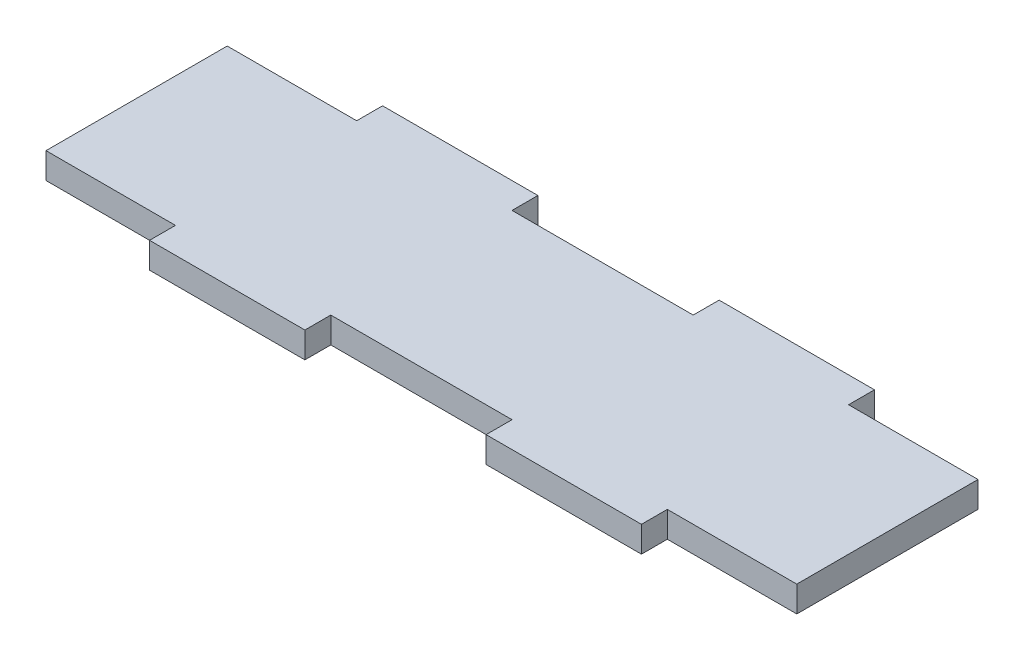
ISO-10303-21;
HEADER;
FILE_DESCRIPTION(('STEP AP214'),'2;1');
FILE_NAME('part.step','',(''),(''),'','','');
FILE_SCHEMA(('AUTOMOTIVE_DESIGN { 1 0 10303 214 1 1 1 1 }'));
ENDSEC;
DATA;
#1=APPLICATION_CONTEXT('core data for automotive mechanical design processes');
#2=APPLICATION_PROTOCOL_DEFINITION('international standard','automotive_design',2000,#1);
#3=PRODUCT_CONTEXT('',#1,'mechanical');
#4=PRODUCT('Part','Part','',(#3));
#5=PRODUCT_RELATED_PRODUCT_CATEGORY('part','',(#4));
#6=PRODUCT_DEFINITION_FORMATION('','',#4);
#7=PRODUCT_DEFINITION_CONTEXT('part definition',#1,'design');
#8=PRODUCT_DEFINITION('design','',#6,#7);
#9=PRODUCT_DEFINITION_SHAPE('','',#8);
#10=(LENGTH_UNIT() NAMED_UNIT(*) SI_UNIT(.MILLI.,.METRE.));
#11=(NAMED_UNIT(*) PLANE_ANGLE_UNIT() SI_UNIT($,.RADIAN.));
#12=(NAMED_UNIT(*) SI_UNIT($,.STERADIAN.) SOLID_ANGLE_UNIT());
#13=UNCERTAINTY_MEASURE_WITH_UNIT(LENGTH_MEASURE(1.E-05),#10,'distance_accuracy_value','');
#14=(GEOMETRIC_REPRESENTATION_CONTEXT(3) GLOBAL_UNCERTAINTY_ASSIGNED_CONTEXT((#13)) GLOBAL_UNIT_ASSIGNED_CONTEXT((#10,
#11,#12)) REPRESENTATION_CONTEXT('',''));
#15=CARTESIAN_POINT('',(0.,0.,0.));
#16=DIRECTION('',(0.,0.,1.));
#17=DIRECTION('',(1.,0.,0.));
#18=AXIS2_PLACEMENT_3D('',#15,#16,#17);
#19=CARTESIAN_POINT('',(290.,10.,-80.));
#20=DIRECTION('',(-1.,0.,0.));
#21=DIRECTION('',(0.,0.,1.));
#22=AXIS2_PLACEMENT_3D('',#19,#20,#21);
#23=PLANE('',#22);
#24=DIRECTION('',(0.,0.,-1.));
#25=VECTOR('',#24,1.);
#26=CARTESIAN_POINT('',(290.,0.,-80.));
#27=LINE('',#26,#25);
#28=CARTESIAN_POINT('',(290.,0.,-10.));
#29=VERTEX_POINT('',#28);
#30=CARTESIAN_POINT('',(290.,0.,-80.));
#31=VERTEX_POINT('',#30);
#32=EDGE_CURVE('E200',#29,#31,#27,.T.);
#33=ORIENTED_EDGE('',*,*,#32,.T.);
#34=DIRECTION('',(0.,-1.,0.));
#35=VECTOR('',#34,1.);
#36=CARTESIAN_POINT('',(290.,10.,-80.));
#37=LINE('',#36,#35);
#38=CARTESIAN_POINT('',(290.,10.,-80.));
#39=VERTEX_POINT('',#38);
#40=EDGE_CURVE('E11',#39,#31,#37,.T.);
#41=ORIENTED_EDGE('',*,*,#40,.F.);
#42=DIRECTION('',(0.,0.,-1.));
#43=VECTOR('',#42,1.);
#44=CARTESIAN_POINT('',(290.,10.,-80.));
#45=LINE('',#44,#43);
#46=CARTESIAN_POINT('',(290.,10.,-10.));
#47=VERTEX_POINT('',#46);
#48=EDGE_CURVE('E238',#47,#39,#45,.T.);
#49=ORIENTED_EDGE('',*,*,#48,.F.);
#50=DIRECTION('',(0.,-1.,0.));
#51=VECTOR('',#50,1.);
#52=CARTESIAN_POINT('',(290.,10.,-10.));
#53=LINE('',#52,#51);
#54=EDGE_CURVE('E196',#47,#29,#53,.T.);
#55=ORIENTED_EDGE('',*,*,#54,.T.);
#56=EDGE_LOOP('',(#33,#41,#49,#55));
#57=FACE_BOUND('',#56,.T.);
#58=ADVANCED_FACE('F32',(#57),#23,.F.);
#59=CARTESIAN_POINT('',(240.,10.,-80.));
#60=DIRECTION('',(0.,0.,1.));
#61=DIRECTION('',(1.,0.,0.));
#62=AXIS2_PLACEMENT_3D('',#59,#60,#61);
#63=PLANE('',#62);
#64=DIRECTION('',(-1.,0.,0.));
#65=VECTOR('',#64,1.);
#66=CARTESIAN_POINT('',(240.,0.,-80.));
#67=LINE('',#66,#65);
#68=CARTESIAN_POINT('',(240.,0.,-80.));
#69=VERTEX_POINT('',#68);
#70=EDGE_CURVE('E203',#31,#69,#67,.T.);
#71=ORIENTED_EDGE('',*,*,#70,.T.);
#72=DIRECTION('',(0.,-1.,0.));
#73=VECTOR('',#72,1.);
#74=CARTESIAN_POINT('',(240.,10.,-80.));
#75=LINE('',#74,#73);
#76=CARTESIAN_POINT('',(240.,10.,-80.));
#77=VERTEX_POINT('',#76);
#78=EDGE_CURVE('E40',#77,#69,#75,.T.);
#79=ORIENTED_EDGE('',*,*,#78,.F.);
#80=DIRECTION('',(-1.,0.,0.));
#81=VECTOR('',#80,1.);
#82=CARTESIAN_POINT('',(240.,10.,-80.));
#83=LINE('',#82,#81);
#84=EDGE_CURVE('E127',#39,#77,#83,.T.);
#85=ORIENTED_EDGE('',*,*,#84,.F.);
#86=ORIENTED_EDGE('',*,*,#40,.T.);
#87=EDGE_LOOP('',(#71,#79,#85,#86));
#88=FACE_BOUND('',#87,.T.);
#89=ADVANCED_FACE('F356',(#88),#63,.F.);
#90=CARTESIAN_POINT('',(240.,10.,-90.));
#91=DIRECTION('',(-1.,0.,0.));
#92=DIRECTION('',(0.,0.,1.));
#93=AXIS2_PLACEMENT_3D('',#90,#91,#92);
#94=PLANE('',#93);
#95=DIRECTION('',(0.,0.,-1.));
#96=VECTOR('',#95,1.);
#97=CARTESIAN_POINT('',(240.,0.,-90.));
#98=LINE('',#97,#96);
#99=CARTESIAN_POINT('',(240.,0.,-90.));
#100=VERTEX_POINT('',#99);
#101=EDGE_CURVE('E205',#69,#100,#98,.T.);
#102=ORIENTED_EDGE('',*,*,#101,.T.);
#103=DIRECTION('',(0.,-1.,0.));
#104=VECTOR('',#103,1.);
#105=CARTESIAN_POINT('',(240.,10.,-90.));
#106=LINE('',#105,#104);
#107=CARTESIAN_POINT('',(240.,10.,-90.));
#108=VERTEX_POINT('',#107);
#109=EDGE_CURVE('E281',#108,#100,#106,.T.);
#110=ORIENTED_EDGE('',*,*,#109,.F.);
#111=DIRECTION('',(0.,0.,-1.));
#112=VECTOR('',#111,1.);
#113=CARTESIAN_POINT('',(240.,10.,-90.));
#114=LINE('',#113,#112);
#115=EDGE_CURVE('E289',#77,#108,#114,.T.);
#116=ORIENTED_EDGE('',*,*,#115,.F.);
#117=ORIENTED_EDGE('',*,*,#78,.T.);
#118=EDGE_LOOP('',(#102,#110,#116,#117));
#119=FACE_BOUND('',#118,.T.);
#120=ADVANCED_FACE('F287',(#119),#94,.F.);
#121=CARTESIAN_POINT('',(180.,10.,-90.));
#122=DIRECTION('',(0.,0.,1.));
#123=DIRECTION('',(1.,0.,0.));
#124=AXIS2_PLACEMENT_3D('',#121,#122,#123);
#125=PLANE('',#124);
#126=DIRECTION('',(-1.,0.,0.));
#127=VECTOR('',#126,1.);
#128=CARTESIAN_POINT('',(180.,0.,-90.));
#129=LINE('',#128,#127);
#130=CARTESIAN_POINT('',(180.,0.,-90.));
#131=VERTEX_POINT('',#130);
#132=EDGE_CURVE('E207',#100,#131,#129,.T.);
#133=ORIENTED_EDGE('',*,*,#132,.T.);
#134=DIRECTION('',(0.,-1.,0.));
#135=VECTOR('',#134,1.);
#136=CARTESIAN_POINT('',(180.,10.,-90.));
#137=LINE('',#136,#135);
#138=CARTESIAN_POINT('',(180.,10.,-90.));
#139=VERTEX_POINT('',#138);
#140=EDGE_CURVE('E278',#139,#131,#137,.T.);
#141=ORIENTED_EDGE('',*,*,#140,.F.);
#142=DIRECTION('',(-1.,0.,0.));
#143=VECTOR('',#142,1.);
#144=CARTESIAN_POINT('',(180.,10.,-90.));
#145=LINE('',#144,#143);
#146=EDGE_CURVE('E307',#108,#139,#145,.T.);
#147=ORIENTED_EDGE('',*,*,#146,.F.);
#148=ORIENTED_EDGE('',*,*,#109,.T.);
#149=EDGE_LOOP('',(#133,#141,#147,#148));
#150=FACE_BOUND('',#149,.T.);
#151=ADVANCED_FACE('F298',(#150),#125,.F.);
#152=CARTESIAN_POINT('',(180.,10.,-80.));
#153=DIRECTION('',(1.,0.,0.));
#154=DIRECTION('',(0.,0.,-1.));
#155=AXIS2_PLACEMENT_3D('',#152,#153,#154);
#156=PLANE('',#155);
#157=DIRECTION('',(0.,0.,1.));
#158=VECTOR('',#157,1.);
#159=CARTESIAN_POINT('',(180.,0.,-80.));
#160=LINE('',#159,#158);
#161=CARTESIAN_POINT('',(180.,0.,-80.));
#162=VERTEX_POINT('',#161);
#163=EDGE_CURVE('E209',#131,#162,#160,.T.);
#164=ORIENTED_EDGE('',*,*,#163,.T.);
#165=DIRECTION('',(0.,-1.,0.));
#166=VECTOR('',#165,1.);
#167=CARTESIAN_POINT('',(180.,10.,-80.));
#168=LINE('',#167,#166);
#169=CARTESIAN_POINT('',(180.,10.,-80.));
#170=VERTEX_POINT('',#169);
#171=EDGE_CURVE('E275',#170,#162,#168,.T.);
#172=ORIENTED_EDGE('',*,*,#171,.F.);
#173=DIRECTION('',(0.,0.,1.));
#174=VECTOR('',#173,1.);
#175=CARTESIAN_POINT('',(180.,10.,-80.));
#176=LINE('',#175,#174);
#177=EDGE_CURVE('E304',#139,#170,#176,.T.);
#178=ORIENTED_EDGE('',*,*,#177,.F.);
#179=ORIENTED_EDGE('',*,*,#140,.T.);
#180=EDGE_LOOP('',(#164,#172,#178,#179));
#181=FACE_BOUND('',#180,.T.);
#182=ADVANCED_FACE('F302',(#181),#156,.F.);
#183=CARTESIAN_POINT('',(110.,10.,-80.));
#184=DIRECTION('',(0.,0.,1.));
#185=DIRECTION('',(1.,0.,0.));
#186=AXIS2_PLACEMENT_3D('',#183,#184,#185);
#187=PLANE('',#186);
#188=DIRECTION('',(-1.,0.,0.));
#189=VECTOR('',#188,1.);
#190=CARTESIAN_POINT('',(110.,0.,-80.));
#191=LINE('',#190,#189);
#192=CARTESIAN_POINT('',(110.,0.,-80.));
#193=VERTEX_POINT('',#192);
#194=EDGE_CURVE('E211',#162,#193,#191,.T.);
#195=ORIENTED_EDGE('',*,*,#194,.T.);
#196=DIRECTION('',(0.,-1.,0.));
#197=VECTOR('',#196,1.);
#198=CARTESIAN_POINT('',(110.,10.,-80.));
#199=LINE('',#198,#197);
#200=CARTESIAN_POINT('',(110.,10.,-80.));
#201=VERTEX_POINT('',#200);
#202=EDGE_CURVE('E272',#201,#193,#199,.T.);
#203=ORIENTED_EDGE('',*,*,#202,.F.);
#204=DIRECTION('',(-1.,0.,0.));
#205=VECTOR('',#204,1.);
#206=CARTESIAN_POINT('',(110.,10.,-80.));
#207=LINE('',#206,#205);
#208=EDGE_CURVE('E306',#170,#201,#207,.T.);
#209=ORIENTED_EDGE('',*,*,#208,.F.);
#210=ORIENTED_EDGE('',*,*,#171,.T.);
#211=EDGE_LOOP('',(#195,#203,#209,#210));
#212=FACE_BOUND('',#211,.T.);
#213=ADVANCED_FACE('F369',(#212),#187,.F.);
#214=CARTESIAN_POINT('',(110.,10.,-90.));
#215=DIRECTION('',(-1.,0.,0.));
#216=DIRECTION('',(0.,0.,1.));
#217=AXIS2_PLACEMENT_3D('',#214,#215,#216);
#218=PLANE('',#217);
#219=DIRECTION('',(0.,0.,-1.));
#220=VECTOR('',#219,1.);
#221=CARTESIAN_POINT('',(110.,0.,-90.));
#222=LINE('',#221,#220);
#223=CARTESIAN_POINT('',(110.,0.,-90.));
#224=VERTEX_POINT('',#223);
#225=EDGE_CURVE('E213',#193,#224,#222,.T.);
#226=ORIENTED_EDGE('',*,*,#225,.T.);
#227=DIRECTION('',(0.,-1.,0.));
#228=VECTOR('',#227,1.);
#229=CARTESIAN_POINT('',(110.,10.,-90.));
#230=LINE('',#229,#228);
#231=CARTESIAN_POINT('',(110.,10.,-90.));
#232=VERTEX_POINT('',#231);
#233=EDGE_CURVE('E269',#232,#224,#230,.T.);
#234=ORIENTED_EDGE('',*,*,#233,.F.);
#235=DIRECTION('',(0.,0.,-1.));
#236=VECTOR('',#235,1.);
#237=CARTESIAN_POINT('',(110.,10.,-90.));
#238=LINE('',#237,#236);
#239=EDGE_CURVE('E309',#201,#232,#238,.T.);
#240=ORIENTED_EDGE('',*,*,#239,.F.);
#241=ORIENTED_EDGE('',*,*,#202,.T.);
#242=EDGE_LOOP('',(#226,#234,#240,#241));
#243=FACE_BOUND('',#242,.T.);
#244=ADVANCED_FACE('F372',(#243),#218,.F.);
#245=CARTESIAN_POINT('',(50.,10.,-90.));
#246=DIRECTION('',(0.,0.,1.));
#247=DIRECTION('',(1.,0.,0.));
#248=AXIS2_PLACEMENT_3D('',#245,#246,#247);
#249=PLANE('',#248);
#250=DIRECTION('',(-1.,0.,0.));
#251=VECTOR('',#250,1.);
#252=CARTESIAN_POINT('',(50.,0.,-90.));
#253=LINE('',#252,#251);
#254=CARTESIAN_POINT('',(50.,0.,-90.));
#255=VERTEX_POINT('',#254);
#256=EDGE_CURVE('E215',#224,#255,#253,.T.);
#257=ORIENTED_EDGE('',*,*,#256,.T.);
#258=DIRECTION('',(0.,-1.,0.));
#259=VECTOR('',#258,1.);
#260=CARTESIAN_POINT('',(50.,10.,-90.));
#261=LINE('',#260,#259);
#262=CARTESIAN_POINT('',(50.,10.,-90.));
#263=VERTEX_POINT('',#262);
#264=EDGE_CURVE('E266',#263,#255,#261,.T.);
#265=ORIENTED_EDGE('',*,*,#264,.F.);
#266=DIRECTION('',(-1.,0.,0.));
#267=VECTOR('',#266,1.);
#268=CARTESIAN_POINT('',(50.,10.,-90.));
#269=LINE('',#268,#267);
#270=EDGE_CURVE('E315',#232,#263,#269,.T.);
#271=ORIENTED_EDGE('',*,*,#270,.F.);
#272=ORIENTED_EDGE('',*,*,#233,.T.);
#273=EDGE_LOOP('',(#257,#265,#271,#272));
#274=FACE_BOUND('',#273,.T.);
#275=ADVANCED_FACE('F376',(#274),#249,.F.);
#276=CARTESIAN_POINT('',(50.,10.,-80.));
#277=DIRECTION('',(1.,0.,0.));
#278=DIRECTION('',(0.,0.,-1.));
#279=AXIS2_PLACEMENT_3D('',#276,#277,#278);
#280=PLANE('',#279);
#281=DIRECTION('',(0.,0.,1.));
#282=VECTOR('',#281,1.);
#283=CARTESIAN_POINT('',(50.,0.,-80.));
#284=LINE('',#283,#282);
#285=CARTESIAN_POINT('',(50.,0.,-80.));
#286=VERTEX_POINT('',#285);
#287=EDGE_CURVE('E217',#255,#286,#284,.T.);
#288=ORIENTED_EDGE('',*,*,#287,.T.);
#289=DIRECTION('',(0.,-1.,0.));
#290=VECTOR('',#289,1.);
#291=CARTESIAN_POINT('',(50.,10.,-80.));
#292=LINE('',#291,#290);
#293=CARTESIAN_POINT('',(50.,10.,-80.));
#294=VERTEX_POINT('',#293);
#295=EDGE_CURVE('E263',#294,#286,#292,.T.);
#296=ORIENTED_EDGE('',*,*,#295,.F.);
#297=DIRECTION('',(0.,0.,1.));
#298=VECTOR('',#297,1.);
#299=CARTESIAN_POINT('',(50.,10.,-80.));
#300=LINE('',#299,#298);
#301=EDGE_CURVE('E317',#263,#294,#300,.T.);
#302=ORIENTED_EDGE('',*,*,#301,.F.);
#303=ORIENTED_EDGE('',*,*,#264,.T.);
#304=EDGE_LOOP('',(#288,#296,#302,#303));
#305=FACE_BOUND('',#304,.T.);
#306=ADVANCED_FACE('F380',(#305),#280,.F.);
#307=CARTESIAN_POINT('',(0.,10.,-79.9999999999999));
#308=DIRECTION('',(0.,0.,1.));
#309=DIRECTION('',(1.,0.,0.));
#310=AXIS2_PLACEMENT_3D('',#307,#308,#309);
#311=PLANE('',#310);
#312=DIRECTION('',(-1.,0.,0.));
#313=VECTOR('',#312,1.);
#314=CARTESIAN_POINT('',(0.,0.,-79.9999999999999));
#315=LINE('',#314,#313);
#316=CARTESIAN_POINT('',(0.,0.,-79.9999999999999));
#317=VERTEX_POINT('',#316);
#318=EDGE_CURVE('E219',#286,#317,#315,.T.);
#319=ORIENTED_EDGE('',*,*,#318,.T.);
#320=DIRECTION('',(0.,-1.,0.));
#321=VECTOR('',#320,1.);
#322=CARTESIAN_POINT('',(0.,10.,-79.9999999999999));
#323=LINE('',#322,#321);
#324=CARTESIAN_POINT('',(0.,10.,-79.9999999999999));
#325=VERTEX_POINT('',#324);
#326=EDGE_CURVE('E260',#325,#317,#323,.T.);
#327=ORIENTED_EDGE('',*,*,#326,.F.);
#328=DIRECTION('',(-1.,0.,0.));
#329=VECTOR('',#328,1.);
#330=CARTESIAN_POINT('',(0.,10.,-79.9999999999999));
#331=LINE('',#330,#329);
#332=EDGE_CURVE('E319',#294,#325,#331,.T.);
#333=ORIENTED_EDGE('',*,*,#332,.F.);
#334=ORIENTED_EDGE('',*,*,#295,.T.);
#335=EDGE_LOOP('',(#319,#327,#333,#334));
#336=FACE_BOUND('',#335,.T.);
#337=ADVANCED_FACE('F384',(#336),#311,.F.);
#338=CARTESIAN_POINT('',(0.,10.,-9.99999999999997));
#339=DIRECTION('',(1.,0.,0.));
#340=DIRECTION('',(0.,0.,-1.));
#341=AXIS2_PLACEMENT_3D('',#338,#339,#340);
#342=PLANE('',#341);
#343=DIRECTION('',(0.,0.,1.));
#344=VECTOR('',#343,1.);
#345=CARTESIAN_POINT('',(0.,0.,-9.99999999999997));
#346=LINE('',#345,#344);
#347=CARTESIAN_POINT('',(0.,0.,-9.99999999999997));
#348=VERTEX_POINT('',#347);
#349=EDGE_CURVE('E221',#317,#348,#346,.T.);
#350=ORIENTED_EDGE('',*,*,#349,.T.);
#351=DIRECTION('',(0.,-1.,0.));
#352=VECTOR('',#351,1.);
#353=CARTESIAN_POINT('',(0.,10.,-9.99999999999997));
#354=LINE('',#353,#352);
#355=CARTESIAN_POINT('',(0.,10.,-9.99999999999997));
#356=VERTEX_POINT('',#355);
#357=EDGE_CURVE('E257',#356,#348,#354,.T.);
#358=ORIENTED_EDGE('',*,*,#357,.F.);
#359=DIRECTION('',(0.,0.,1.));
#360=VECTOR('',#359,1.);
#361=CARTESIAN_POINT('',(0.,10.,-9.99999999999997));
#362=LINE('',#361,#360);
#363=EDGE_CURVE('E321',#325,#356,#362,.T.);
#364=ORIENTED_EDGE('',*,*,#363,.F.);
#365=ORIENTED_EDGE('',*,*,#326,.T.);
#366=EDGE_LOOP('',(#350,#358,#364,#365));
#367=FACE_BOUND('',#366,.T.);
#368=ADVANCED_FACE('F388',(#367),#342,.F.);
#369=CARTESIAN_POINT('',(0.,10.,-9.99999999999997));
#370=DIRECTION('',(0.,0.,-1.));
#371=DIRECTION('',(-1.,0.,0.));
#372=AXIS2_PLACEMENT_3D('',#369,#370,#371);
#373=PLANE('',#372);
#374=DIRECTION('',(1.,0.,0.));
#375=VECTOR('',#374,1.);
#376=CARTESIAN_POINT('',(0.,0.,-9.99999999999997));
#377=LINE('',#376,#375);
#378=CARTESIAN_POINT('',(50.,0.,-10.));
#379=VERTEX_POINT('',#378);
#380=EDGE_CURVE('E223',#348,#379,#377,.T.);
#381=ORIENTED_EDGE('',*,*,#380,.T.);
#382=DIRECTION('',(0.,-1.,0.));
#383=VECTOR('',#382,1.);
#384=CARTESIAN_POINT('',(50.,10.,-10.));
#385=LINE('',#384,#383);
#386=CARTESIAN_POINT('',(50.,10.,-10.));
#387=VERTEX_POINT('',#386);
#388=EDGE_CURVE('E254',#387,#379,#385,.T.);
#389=ORIENTED_EDGE('',*,*,#388,.F.);
#390=DIRECTION('',(1.,0.,0.));
#391=VECTOR('',#390,1.);
#392=CARTESIAN_POINT('',(0.,10.,-9.99999999999997));
#393=LINE('',#392,#391);
#394=EDGE_CURVE('E323',#356,#387,#393,.T.);
#395=ORIENTED_EDGE('',*,*,#394,.F.);
#396=ORIENTED_EDGE('',*,*,#357,.T.);
#397=EDGE_LOOP('',(#381,#389,#395,#396));
#398=FACE_BOUND('',#397,.T.);
#399=ADVANCED_FACE('F392',(#398),#373,.F.);
#400=CARTESIAN_POINT('',(50.,10.,-10.));
#401=DIRECTION('',(1.,0.,0.));
#402=DIRECTION('',(0.,0.,-1.));
#403=AXIS2_PLACEMENT_3D('',#400,#401,#402);
#404=PLANE('',#403);
#405=DIRECTION('',(0.,0.,1.));
#406=VECTOR('',#405,1.);
#407=CARTESIAN_POINT('',(50.,0.,-10.));
#408=LINE('',#407,#406);
#409=CARTESIAN_POINT('',(50.,0.,0.));
#410=VERTEX_POINT('',#409);
#411=EDGE_CURVE('E225',#379,#410,#408,.T.);
#412=ORIENTED_EDGE('',*,*,#411,.T.);
#413=DIRECTION('',(0.,-1.,0.));
#414=VECTOR('',#413,1.);
#415=CARTESIAN_POINT('',(50.,10.,0.));
#416=LINE('',#415,#414);
#417=CARTESIAN_POINT('',(50.,10.,0.));
#418=VERTEX_POINT('',#417);
#419=EDGE_CURVE('E251',#418,#410,#416,.T.);
#420=ORIENTED_EDGE('',*,*,#419,.F.);
#421=DIRECTION('',(0.,0.,1.));
#422=VECTOR('',#421,1.);
#423=CARTESIAN_POINT('',(50.,10.,-10.));
#424=LINE('',#423,#422);
#425=EDGE_CURVE('E325',#387,#418,#424,.T.);
#426=ORIENTED_EDGE('',*,*,#425,.F.);
#427=ORIENTED_EDGE('',*,*,#388,.T.);
#428=EDGE_LOOP('',(#412,#420,#426,#427));
#429=FACE_BOUND('',#428,.T.);
#430=ADVANCED_FACE('F396',(#429),#404,.F.);
#431=CARTESIAN_POINT('',(50.,10.,0.));
#432=DIRECTION('',(0.,0.,-1.));
#433=DIRECTION('',(-1.,0.,0.));
#434=AXIS2_PLACEMENT_3D('',#431,#432,#433);
#435=PLANE('',#434);
#436=DIRECTION('',(1.,0.,0.));
#437=VECTOR('',#436,1.);
#438=CARTESIAN_POINT('',(50.,0.,0.));
#439=LINE('',#438,#437);
#440=CARTESIAN_POINT('',(110.,0.,0.));
#441=VERTEX_POINT('',#440);
#442=EDGE_CURVE('E227',#410,#441,#439,.T.);
#443=ORIENTED_EDGE('',*,*,#442,.T.);
#444=DIRECTION('',(0.,-1.,0.));
#445=VECTOR('',#444,1.);
#446=CARTESIAN_POINT('',(110.,10.,0.));
#447=LINE('',#446,#445);
#448=CARTESIAN_POINT('',(110.,10.,0.));
#449=VERTEX_POINT('',#448);
#450=EDGE_CURVE('E248',#449,#441,#447,.T.);
#451=ORIENTED_EDGE('',*,*,#450,.F.);
#452=DIRECTION('',(1.,0.,0.));
#453=VECTOR('',#452,1.);
#454=CARTESIAN_POINT('',(50.,10.,0.));
#455=LINE('',#454,#453);
#456=EDGE_CURVE('E327',#418,#449,#455,.T.);
#457=ORIENTED_EDGE('',*,*,#456,.F.);
#458=ORIENTED_EDGE('',*,*,#419,.T.);
#459=EDGE_LOOP('',(#443,#451,#457,#458));
#460=FACE_BOUND('',#459,.T.);
#461=ADVANCED_FACE('F400',(#460),#435,.F.);
#462=CARTESIAN_POINT('',(110.,10.,0.));
#463=DIRECTION('',(-1.,0.,0.));
#464=DIRECTION('',(0.,0.,1.));
#465=AXIS2_PLACEMENT_3D('',#462,#463,#464);
#466=PLANE('',#465);
#467=DIRECTION('',(0.,0.,-1.));
#468=VECTOR('',#467,1.);
#469=CARTESIAN_POINT('',(110.,0.,0.));
#470=LINE('',#469,#468);
#471=CARTESIAN_POINT('',(110.,0.,-9.99999999999998));
#472=VERTEX_POINT('',#471);
#473=EDGE_CURVE('E229',#441,#472,#470,.T.);
#474=ORIENTED_EDGE('',*,*,#473,.T.);
#475=DIRECTION('',(0.,-1.,0.));
#476=VECTOR('',#475,1.);
#477=CARTESIAN_POINT('',(110.,10.,-9.99999999999998));
#478=LINE('',#477,#476);
#479=CARTESIAN_POINT('',(110.,10.,-9.99999999999998));
#480=VERTEX_POINT('',#479);
#481=EDGE_CURVE('E245',#480,#472,#478,.T.);
#482=ORIENTED_EDGE('',*,*,#481,.F.);
#483=DIRECTION('',(0.,0.,-1.));
#484=VECTOR('',#483,1.);
#485=CARTESIAN_POINT('',(110.,10.,0.));
#486=LINE('',#485,#484);
#487=EDGE_CURVE('E329',#449,#480,#486,.T.);
#488=ORIENTED_EDGE('',*,*,#487,.F.);
#489=ORIENTED_EDGE('',*,*,#450,.T.);
#490=EDGE_LOOP('',(#474,#482,#488,#489));
#491=FACE_BOUND('',#490,.T.);
#492=ADVANCED_FACE('F404',(#491),#466,.F.);
#493=CARTESIAN_POINT('',(110.,10.,-9.99999999999998));
#494=DIRECTION('',(0.,0.,-1.));
#495=DIRECTION('',(-1.,0.,0.));
#496=AXIS2_PLACEMENT_3D('',#493,#494,#495);
#497=PLANE('',#496);
#498=DIRECTION('',(1.,0.,0.));
#499=VECTOR('',#498,1.);
#500=CARTESIAN_POINT('',(110.,0.,-9.99999999999998));
#501=LINE('',#500,#499);
#502=CARTESIAN_POINT('',(180.,0.,-9.99999999999998));
#503=VERTEX_POINT('',#502);
#504=EDGE_CURVE('E231',#472,#503,#501,.T.);
#505=ORIENTED_EDGE('',*,*,#504,.T.);
#506=DIRECTION('',(0.,-1.,0.));
#507=VECTOR('',#506,1.);
#508=CARTESIAN_POINT('',(180.,10.,-9.99999999999998));
#509=LINE('',#508,#507);
#510=CARTESIAN_POINT('',(180.,10.,-9.99999999999998));
#511=VERTEX_POINT('',#510);
#512=EDGE_CURVE('E242',#511,#503,#509,.T.);
#513=ORIENTED_EDGE('',*,*,#512,.F.);
#514=DIRECTION('',(1.,0.,0.));
#515=VECTOR('',#514,1.);
#516=CARTESIAN_POINT('',(110.,10.,-9.99999999999998));
#517=LINE('',#516,#515);
#518=EDGE_CURVE('E331',#480,#511,#517,.T.);
#519=ORIENTED_EDGE('',*,*,#518,.F.);
#520=ORIENTED_EDGE('',*,*,#481,.T.);
#521=EDGE_LOOP('',(#505,#513,#519,#520));
#522=FACE_BOUND('',#521,.T.);
#523=ADVANCED_FACE('F337',(#522),#497,.F.);
#524=CARTESIAN_POINT('',(180.,10.,-9.99999999999998));
#525=DIRECTION('',(1.,0.,0.));
#526=DIRECTION('',(0.,0.,-1.));
#527=AXIS2_PLACEMENT_3D('',#524,#525,#526);
#528=PLANE('',#527);
#529=DIRECTION('',(0.,0.,1.));
#530=VECTOR('',#529,1.);
#531=CARTESIAN_POINT('',(180.,0.,-9.99999999999998));
#532=LINE('',#531,#530);
#533=CARTESIAN_POINT('',(180.,0.,0.));
#534=VERTEX_POINT('',#533);
#535=EDGE_CURVE('E233',#503,#534,#532,.T.);
#536=ORIENTED_EDGE('',*,*,#535,.T.);
#537=DIRECTION('',(0.,-1.,0.));
#538=VECTOR('',#537,1.);
#539=CARTESIAN_POINT('',(180.,10.,0.));
#540=LINE('',#539,#538);
#541=CARTESIAN_POINT('',(180.,10.,0.));
#542=VERTEX_POINT('',#541);
#543=EDGE_CURVE('E191',#542,#534,#540,.T.);
#544=ORIENTED_EDGE('',*,*,#543,.F.);
#545=DIRECTION('',(0.,0.,1.));
#546=VECTOR('',#545,1.);
#547=CARTESIAN_POINT('',(180.,10.,-9.99999999999998));
#548=LINE('',#547,#546);
#549=EDGE_CURVE('E182',#511,#542,#548,.T.);
#550=ORIENTED_EDGE('',*,*,#549,.F.);
#551=ORIENTED_EDGE('',*,*,#512,.T.);
#552=EDGE_LOOP('',(#536,#544,#550,#551));
#553=FACE_BOUND('',#552,.T.);
#554=ADVANCED_FACE('F341',(#553),#528,.F.);
#555=CARTESIAN_POINT('',(180.,10.,0.));
#556=DIRECTION('',(0.,0.,-1.));
#557=DIRECTION('',(-1.,0.,0.));
#558=AXIS2_PLACEMENT_3D('',#555,#556,#557);
#559=PLANE('',#558);
#560=DIRECTION('',(1.,0.,0.));
#561=VECTOR('',#560,1.);
#562=CARTESIAN_POINT('',(180.,0.,0.));
#563=LINE('',#562,#561);
#564=CARTESIAN_POINT('',(240.,0.,0.));
#565=VERTEX_POINT('',#564);
#566=EDGE_CURVE('E190',#534,#565,#563,.T.);
#567=ORIENTED_EDGE('',*,*,#566,.T.);
#568=DIRECTION('',(0.,-1.,0.));
#569=VECTOR('',#568,1.);
#570=CARTESIAN_POINT('',(240.,10.,0.));
#571=LINE('',#570,#569);
#572=CARTESIAN_POINT('',(240.,10.,0.));
#573=VERTEX_POINT('',#572);
#574=EDGE_CURVE('E187',#573,#565,#571,.T.);
#575=ORIENTED_EDGE('',*,*,#574,.F.);
#576=DIRECTION('',(1.,0.,0.));
#577=VECTOR('',#576,1.);
#578=CARTESIAN_POINT('',(180.,10.,0.));
#579=LINE('',#578,#577);
#580=EDGE_CURVE('E176',#542,#573,#579,.T.);
#581=ORIENTED_EDGE('',*,*,#580,.F.);
#582=ORIENTED_EDGE('',*,*,#543,.T.);
#583=EDGE_LOOP('',(#567,#575,#581,#582));
#584=FACE_BOUND('',#583,.T.);
#585=ADVANCED_FACE('F188',(#584),#559,.F.);
#586=CARTESIAN_POINT('',(240.,10.,0.));
#587=DIRECTION('',(-1.,0.,0.));
#588=DIRECTION('',(0.,0.,1.));
#589=AXIS2_PLACEMENT_3D('',#586,#587,#588);
#590=PLANE('',#589);
#591=DIRECTION('',(0.,0.,-1.));
#592=VECTOR('',#591,1.);
#593=CARTESIAN_POINT('',(240.,0.,0.));
#594=LINE('',#593,#592);
#595=CARTESIAN_POINT('',(240.,0.,-9.99999999999999));
#596=VERTEX_POINT('',#595);
#597=EDGE_CURVE('E113',#565,#596,#594,.T.);
#598=ORIENTED_EDGE('',*,*,#597,.T.);
#599=DIRECTION('',(0.,-1.,0.));
#600=VECTOR('',#599,1.);
#601=CARTESIAN_POINT('',(240.,10.,-9.99999999999999));
#602=LINE('',#601,#600);
#603=CARTESIAN_POINT('',(240.,10.,-9.99999999999999));
#604=VERTEX_POINT('',#603);
#605=EDGE_CURVE('E192',#604,#596,#602,.T.);
#606=ORIENTED_EDGE('',*,*,#605,.F.);
#607=DIRECTION('',(0.,0.,-1.));
#608=VECTOR('',#607,1.);
#609=CARTESIAN_POINT('',(240.,10.,0.));
#610=LINE('',#609,#608);
#611=EDGE_CURVE('E180',#573,#604,#610,.T.);
#612=ORIENTED_EDGE('',*,*,#611,.F.);
#613=ORIENTED_EDGE('',*,*,#574,.T.);
#614=EDGE_LOOP('',(#598,#606,#612,#613));
#615=FACE_BOUND('',#614,.T.);
#616=ADVANCED_FACE('F194',(#615),#590,.F.);
#617=CARTESIAN_POINT('',(240.,10.,-9.99999999999999));
#618=DIRECTION('',(0.,0.,-1.));
#619=DIRECTION('',(-1.,0.,0.));
#620=AXIS2_PLACEMENT_3D('',#617,#618,#619);
#621=PLANE('',#620);
#622=DIRECTION('',(1.,0.,0.));
#623=VECTOR('',#622,1.);
#624=CARTESIAN_POINT('',(240.,0.,-9.99999999999999));
#625=LINE('',#624,#623);
#626=EDGE_CURVE('E119',#596,#29,#625,.T.);
#627=ORIENTED_EDGE('',*,*,#626,.T.);
#628=ORIENTED_EDGE('',*,*,#54,.F.);
#629=DIRECTION('',(1.,0.,0.));
#630=VECTOR('',#629,1.);
#631=CARTESIAN_POINT('',(240.,10.,-9.99999999999999));
#632=LINE('',#631,#630);
#633=EDGE_CURVE('E48',#604,#47,#632,.T.);
#634=ORIENTED_EDGE('',*,*,#633,.F.);
#635=ORIENTED_EDGE('',*,*,#605,.T.);
#636=EDGE_LOOP('',(#627,#628,#634,#635));
#637=FACE_BOUND('',#636,.T.);
#638=ADVANCED_FACE('F345',(#637),#621,.F.);
#639=CARTESIAN_POINT('',(0.,10.,0.));
#640=DIRECTION('',(0.,1.,0.));
#641=DIRECTION('',(0.,0.,1.));
#642=AXIS2_PLACEMENT_3D('',#639,#640,#641);
#643=PLANE('',#642);
#644=ORIENTED_EDGE('',*,*,#48,.T.);
#645=ORIENTED_EDGE('',*,*,#84,.T.);
#646=ORIENTED_EDGE('',*,*,#115,.T.);
#647=ORIENTED_EDGE('',*,*,#146,.T.);
#648=ORIENTED_EDGE('',*,*,#177,.T.);
#649=ORIENTED_EDGE('',*,*,#208,.T.);
#650=ORIENTED_EDGE('',*,*,#239,.T.);
#651=ORIENTED_EDGE('',*,*,#270,.T.);
#652=ORIENTED_EDGE('',*,*,#301,.T.);
#653=ORIENTED_EDGE('',*,*,#332,.T.);
#654=ORIENTED_EDGE('',*,*,#363,.T.);
#655=ORIENTED_EDGE('',*,*,#394,.T.);
#656=ORIENTED_EDGE('',*,*,#425,.T.);
#657=ORIENTED_EDGE('',*,*,#456,.T.);
#658=ORIENTED_EDGE('',*,*,#487,.T.);
#659=ORIENTED_EDGE('',*,*,#518,.T.);
#660=ORIENTED_EDGE('',*,*,#549,.T.);
#661=ORIENTED_EDGE('',*,*,#580,.T.);
#662=ORIENTED_EDGE('',*,*,#611,.T.);
#663=ORIENTED_EDGE('',*,*,#633,.T.);
#664=EDGE_LOOP('',(#644,#645,#646,#647,#648,#649,#650,#651,#652,#653,#654,#655,#656,#657,#658,
#659,#660,#661,#662,#663));
#665=FACE_BOUND('',#664,.T.);
#666=ADVANCED_FACE('F178',(#665),#643,.T.);
#667=CARTESIAN_POINT('',(0.,0.,0.));
#668=DIRECTION('',(0.,1.,0.));
#669=DIRECTION('',(0.,0.,1.));
#670=AXIS2_PLACEMENT_3D('',#667,#668,#669);
#671=PLANE('',#670);
#672=ORIENTED_EDGE('',*,*,#32,.F.);
#673=ORIENTED_EDGE('',*,*,#626,.F.);
#674=ORIENTED_EDGE('',*,*,#597,.F.);
#675=ORIENTED_EDGE('',*,*,#566,.F.);
#676=ORIENTED_EDGE('',*,*,#535,.F.);
#677=ORIENTED_EDGE('',*,*,#504,.F.);
#678=ORIENTED_EDGE('',*,*,#473,.F.);
#679=ORIENTED_EDGE('',*,*,#442,.F.);
#680=ORIENTED_EDGE('',*,*,#411,.F.);
#681=ORIENTED_EDGE('',*,*,#380,.F.);
#682=ORIENTED_EDGE('',*,*,#349,.F.);
#683=ORIENTED_EDGE('',*,*,#318,.F.);
#684=ORIENTED_EDGE('',*,*,#287,.F.);
#685=ORIENTED_EDGE('',*,*,#256,.F.);
#686=ORIENTED_EDGE('',*,*,#225,.F.);
#687=ORIENTED_EDGE('',*,*,#194,.F.);
#688=ORIENTED_EDGE('',*,*,#163,.F.);
#689=ORIENTED_EDGE('',*,*,#132,.F.);
#690=ORIENTED_EDGE('',*,*,#101,.F.);
#691=ORIENTED_EDGE('',*,*,#70,.F.);
#692=EDGE_LOOP('',(#672,#673,#674,#675,#676,#677,#678,#679,#680,#681,#682,#683,#684,#685,#686,
#687,#688,#689,#690,#691));
#693=FACE_BOUND('',#692,.T.);
#694=ADVANCED_FACE('F293',(#693),#671,.F.);
#695=CLOSED_SHELL('',(#58,#89,#120,#151,#182,#213,#244,#275,#306,#337,#368,#399,#430,#461,#492,
#523,#554,#585,#616,#638,#666,#694));
#696=MANIFOLD_SOLID_BREP('B2',#695);
#697=ADVANCED_BREP_SHAPE_REPRESENTATION('',(#18,#696),#14);
#698=SHAPE_DEFINITION_REPRESENTATION(#9,#697);
ENDSEC;
END-ISO-10303-21;
